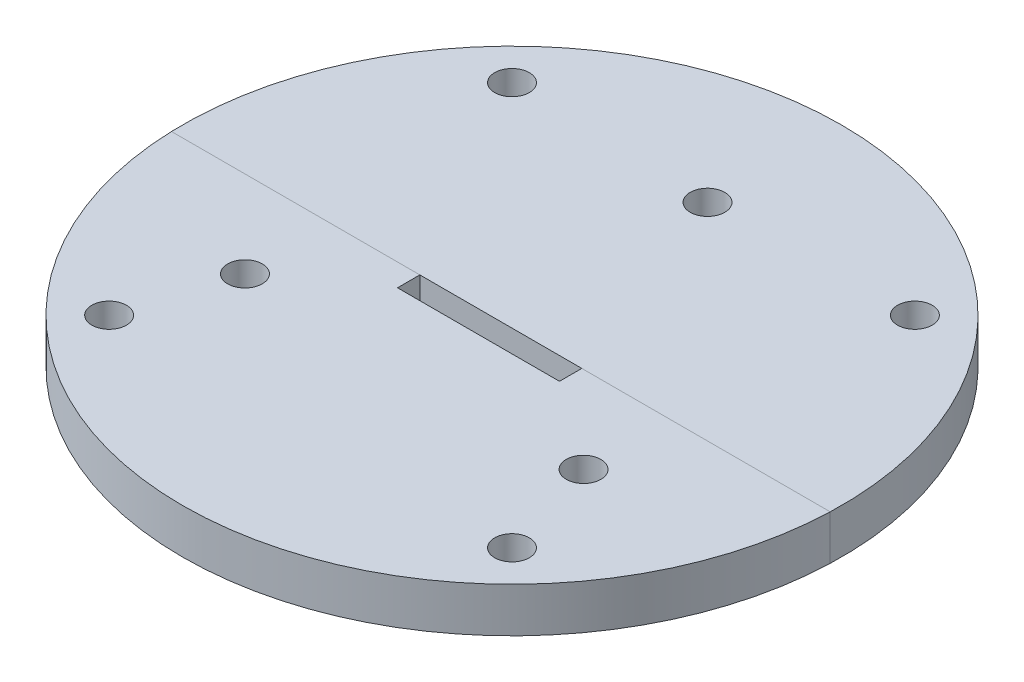
ISO-10303-21;
HEADER;
FILE_DESCRIPTION(('STEP AP214'),'2;1');
FILE_NAME('part.step','',(''),(''),'','','');
FILE_SCHEMA(('AUTOMOTIVE_DESIGN { 1 0 10303 214 1 1 1 1 }'));
ENDSEC;
DATA;
#1=APPLICATION_CONTEXT('core data for automotive mechanical design processes');
#2=APPLICATION_PROTOCOL_DEFINITION('international standard','automotive_design',2000,#1);
#3=PRODUCT_CONTEXT('',#1,'mechanical');
#4=PRODUCT('Part','Part','',(#3));
#5=PRODUCT_RELATED_PRODUCT_CATEGORY('part','',(#4));
#6=PRODUCT_DEFINITION_FORMATION('','',#4);
#7=PRODUCT_DEFINITION_CONTEXT('part definition',#1,'design');
#8=PRODUCT_DEFINITION('design','',#6,#7);
#9=PRODUCT_DEFINITION_SHAPE('','',#8);
#10=(LENGTH_UNIT() NAMED_UNIT(*) SI_UNIT(.MILLI.,.METRE.));
#11=(NAMED_UNIT(*) PLANE_ANGLE_UNIT() SI_UNIT($,.RADIAN.));
#12=(NAMED_UNIT(*) SI_UNIT($,.STERADIAN.) SOLID_ANGLE_UNIT());
#13=UNCERTAINTY_MEASURE_WITH_UNIT(LENGTH_MEASURE(1.E-05),#10,'distance_accuracy_value','');
#14=(GEOMETRIC_REPRESENTATION_CONTEXT(3) GLOBAL_UNCERTAINTY_ASSIGNED_CONTEXT((#13)) GLOBAL_UNIT_ASSIGNED_CONTEXT((#10,
#11,#12)) REPRESENTATION_CONTEXT('',''));
#15=CARTESIAN_POINT('',(0.,0.,0.));
#16=DIRECTION('',(0.,0.,1.));
#17=DIRECTION('',(1.,0.,0.));
#18=AXIS2_PLACEMENT_3D('',#15,#16,#17);
#19=CARTESIAN_POINT('',(-30.66172047433,-0.01,1.));
#20=DIRECTION('',(0.,0.,1.));
#21=DIRECTION('',(1.,0.,0.));
#22=AXIS2_PLACEMENT_3D('',#19,#20,#21);
#23=PLANE('',#22);
#24=DIRECTION('',(-1.,0.,0.));
#25=VECTOR('',#24,1.);
#26=CARTESIAN_POINT('',(-7.25,4.,1.));
#27=LINE('',#26,#25);
#28=CARTESIAN_POINT('',(29.4830459756111,4.,1.));
#29=VERTEX_POINT('',#28);
#30=CARTESIAN_POINT('',(-29.4830459756111,4.,1.));
#31=VERTEX_POINT('',#30);
#32=EDGE_CURVE('E62',#29,#31,#27,.T.);
#33=ORIENTED_EDGE('',*,*,#32,.T.);
#34=DIRECTION('',(0.,-1.,0.));
#35=VECTOR('',#34,1.);
#36=CARTESIAN_POINT('',(-29.4830459756111,4.,1.));
#37=LINE('',#36,#35);
#38=CARTESIAN_POINT('',(-29.4830459756111,0.,1.));
#39=VERTEX_POINT('',#38);
#40=EDGE_CURVE('E78',#31,#39,#37,.T.);
#41=ORIENTED_EDGE('',*,*,#40,.T.);
#42=DIRECTION('',(-1.,0.,0.));
#43=VECTOR('',#42,1.);
#44=CARTESIAN_POINT('',(-7.25,0.,1.));
#45=LINE('',#44,#43);
#46=CARTESIAN_POINT('',(29.4830459756111,0.,1.));
#47=VERTEX_POINT('',#46);
#48=EDGE_CURVE('E73',#47,#39,#45,.T.);
#49=ORIENTED_EDGE('',*,*,#48,.F.);
#50=DIRECTION('',(0.,-1.,0.));
#51=VECTOR('',#50,1.);
#52=CARTESIAN_POINT('',(29.4830459756111,4.,1.));
#53=LINE('',#52,#51);
#54=EDGE_CURVE('E76',#47,#29,#53,.F.);
#55=ORIENTED_EDGE('',*,*,#54,.T.);
#56=EDGE_LOOP('',(#33,#41,#49,#55));
#57=FACE_BOUND('',#56,.T.);
#58=ADVANCED_FACE('F46',(#57),#23,.T.);
#59=CARTESIAN_POINT('',(0.,4.,0.));
#60=DIRECTION('',(0.,-1.,0.));
#61=DIRECTION('',(0.,0.,-1.));
#62=AXIS2_PLACEMENT_3D('',#59,#60,#61);
#63=CYLINDRICAL_SURFACE('',#62,29.5);
#64=ORIENTED_EDGE('',*,*,#40,.F.);
#65=CARTESIAN_POINT('',(0.,4.,0.));
#66=DIRECTION('',(0.,1.,0.));
#67=DIRECTION('',(0.,0.,1.));
#68=AXIS2_PLACEMENT_3D('',#65,#66,#67);
#69=CIRCLE('',#68,29.5);
#70=EDGE_CURVE('E86',#29,#31,#69,.T.);
#71=ORIENTED_EDGE('',*,*,#70,.F.);
#72=ORIENTED_EDGE('',*,*,#54,.F.);
#73=CARTESIAN_POINT('',(0.,0.,0.));
#74=DIRECTION('',(0.,1.,0.));
#75=DIRECTION('',(0.,0.,1.));
#76=AXIS2_PLACEMENT_3D('',#73,#74,#75);
#77=CIRCLE('',#76,29.5);
#78=EDGE_CURVE('E50',#47,#39,#77,.T.);
#79=ORIENTED_EDGE('',*,*,#78,.T.);
#80=EDGE_LOOP('',(#64,#71,#72,#79));
#81=FACE_BOUND('',#80,.T.);
#82=ADVANCED_FACE('F87',(#81),#63,.T.);
#83=CARTESIAN_POINT('',(0.,4.,0.));
#84=DIRECTION('',(0.,1.,0.));
#85=DIRECTION('',(0.,0.,1.));
#86=AXIS2_PLACEMENT_3D('',#83,#84,#85);
#87=PLANE('',#86);
#88=CARTESIAN_POINT('',(-18.031222920257,4.,-18.0312229202569));
#89=DIRECTION('',(0.,1.,0.));
#90=DIRECTION('',(0.,0.,1.));
#91=AXIS2_PLACEMENT_3D('',#88,#89,#90);
#92=CIRCLE('',#91,1.55);
#93=CARTESIAN_POINT('',(-18.031222920257,4.,-16.4812229202569));
#94=VERTEX_POINT('',#93);
#95=EDGE_CURVE('E103',#94,#94,#92,.T.);
#96=ORIENTED_EDGE('',*,*,#95,.F.);
#97=EDGE_LOOP('',(#96));
#98=FACE_BOUND('',#97,.T.);
#99=CARTESIAN_POINT('',(18.0312229202567,4.,-18.0312229202572));
#100=DIRECTION('',(0.,1.,0.));
#101=DIRECTION('',(-1.,0.,0.));
#102=AXIS2_PLACEMENT_3D('',#99,#100,#101);
#103=CIRCLE('',#102,1.55);
#104=CARTESIAN_POINT('',(16.4812229202567,4.,-18.0312229202572));
#105=VERTEX_POINT('',#104);
#106=EDGE_CURVE('E81',#105,#105,#103,.T.);
#107=ORIENTED_EDGE('',*,*,#106,.F.);
#108=EDGE_LOOP('',(#107));
#109=FACE_BOUND('',#108,.T.);
#110=CARTESIAN_POINT('',(0.,4.,-17.5));
#111=DIRECTION('',(0.,1.,0.));
#112=DIRECTION('',(0.,0.,1.));
#113=AXIS2_PLACEMENT_3D('',#110,#111,#112);
#114=CIRCLE('',#113,1.55);
#115=CARTESIAN_POINT('',(0.,4.,-15.95));
#116=VERTEX_POINT('',#115);
#117=EDGE_CURVE('E12',#116,#116,#114,.T.);
#118=ORIENTED_EDGE('',*,*,#117,.F.);
#119=EDGE_LOOP('',(#118));
#120=FACE_BOUND('',#119,.T.);
#121=ORIENTED_EDGE('',*,*,#70,.T.);
#122=ORIENTED_EDGE('',*,*,#32,.F.);
#123=EDGE_LOOP('',(#121,#122));
#124=FACE_BOUND('',#123,.T.);
#125=ADVANCED_FACE('F48',(#98,#109,#120,#124),#87,.T.);
#126=CARTESIAN_POINT('',(0.,0.,0.));
#127=DIRECTION('',(0.,1.,0.));
#128=DIRECTION('',(0.,0.,1.));
#129=AXIS2_PLACEMENT_3D('',#126,#127,#128);
#130=PLANE('',#129);
#131=CARTESIAN_POINT('',(-18.031222920257,0.,-18.0312229202569));
#132=DIRECTION('',(0.,1.,0.));
#133=DIRECTION('',(0.,0.,1.));
#134=AXIS2_PLACEMENT_3D('',#131,#132,#133);
#135=CIRCLE('',#134,1.55);
#136=CARTESIAN_POINT('',(-18.031222920257,0.,-16.4812229202569));
#137=VERTEX_POINT('',#136);
#138=EDGE_CURVE('E85',#137,#137,#135,.T.);
#139=ORIENTED_EDGE('',*,*,#138,.T.);
#140=EDGE_LOOP('',(#139));
#141=FACE_BOUND('',#140,.T.);
#142=CARTESIAN_POINT('',(18.0312229202567,0.,-18.0312229202572));
#143=DIRECTION('',(0.,1.,0.));
#144=DIRECTION('',(-1.,0.,0.));
#145=AXIS2_PLACEMENT_3D('',#142,#143,#144);
#146=CIRCLE('',#145,1.55);
#147=CARTESIAN_POINT('',(16.4812229202567,0.,-18.0312229202572));
#148=VERTEX_POINT('',#147);
#149=EDGE_CURVE('E172',#148,#148,#146,.T.);
#150=ORIENTED_EDGE('',*,*,#149,.T.);
#151=EDGE_LOOP('',(#150));
#152=FACE_BOUND('',#151,.T.);
#153=CARTESIAN_POINT('',(0.,0.,-17.5));
#154=DIRECTION('',(0.,1.,0.));
#155=DIRECTION('',(0.,0.,1.));
#156=AXIS2_PLACEMENT_3D('',#153,#154,#155);
#157=CIRCLE('',#156,1.55);
#158=CARTESIAN_POINT('',(0.,0.,-15.95));
#159=VERTEX_POINT('',#158);
#160=EDGE_CURVE('E55',#159,#159,#157,.T.);
#161=ORIENTED_EDGE('',*,*,#160,.T.);
#162=EDGE_LOOP('',(#161));
#163=FACE_BOUND('',#162,.T.);
#164=ORIENTED_EDGE('',*,*,#48,.T.);
#165=ORIENTED_EDGE('',*,*,#78,.F.);
#166=EDGE_LOOP('',(#164,#165));
#167=FACE_BOUND('',#166,.T.);
#168=ADVANCED_FACE('F83',(#141,#152,#163,#167),#130,.F.);
#169=CARTESIAN_POINT('',(-18.031222920257,0.,-18.0312229202569));
#170=DIRECTION('',(0.,1.,0.));
#171=DIRECTION('',(0.,0.,1.));
#172=AXIS2_PLACEMENT_3D('',#169,#170,#171);
#173=CYLINDRICAL_SURFACE('',#172,1.55);
#174=ORIENTED_EDGE('',*,*,#138,.F.);
#175=EDGE_LOOP('',(#174));
#176=FACE_BOUND('',#175,.T.);
#177=ORIENTED_EDGE('',*,*,#95,.T.);
#178=EDGE_LOOP('',(#177));
#179=FACE_BOUND('',#178,.T.);
#180=ADVANCED_FACE('F97',(#176,#179),#173,.F.);
#181=CARTESIAN_POINT('',(18.0312229202567,0.,-18.0312229202572));
#182=DIRECTION('',(0.,1.,0.));
#183=DIRECTION('',(0.,0.,1.));
#184=AXIS2_PLACEMENT_3D('',#181,#182,#183);
#185=CYLINDRICAL_SURFACE('',#184,1.55);
#186=ORIENTED_EDGE('',*,*,#149,.F.);
#187=EDGE_LOOP('',(#186));
#188=FACE_BOUND('',#187,.T.);
#189=ORIENTED_EDGE('',*,*,#106,.T.);
#190=EDGE_LOOP('',(#189));
#191=FACE_BOUND('',#190,.T.);
#192=ADVANCED_FACE('F111',(#188,#191),#185,.F.);
#193=CARTESIAN_POINT('',(0.,0.,-17.5));
#194=DIRECTION('',(0.,1.,0.));
#195=DIRECTION('',(0.,0.,1.));
#196=AXIS2_PLACEMENT_3D('',#193,#194,#195);
#197=CYLINDRICAL_SURFACE('',#196,1.55);
#198=ORIENTED_EDGE('',*,*,#160,.F.);
#199=EDGE_LOOP('',(#198));
#200=FACE_BOUND('',#199,.T.);
#201=ORIENTED_EDGE('',*,*,#117,.T.);
#202=EDGE_LOOP('',(#201));
#203=FACE_BOUND('',#202,.T.);
#204=ADVANCED_FACE('F109',(#200,#203),#197,.F.);
#205=CLOSED_SHELL('',(#58,#82,#125,#168,#180,#192,#204));
#206=MANIFOLD_SOLID_BREP('B2',#205);
#207=CARTESIAN_POINT('',(-30.66172047433,-0.01,1.));
#208=DIRECTION('',(0.,0.,1.));
#209=DIRECTION('',(1.,0.,0.));
#210=AXIS2_PLACEMENT_3D('',#207,#208,#209);
#211=PLANE('',#210);
#212=DIRECTION('',(1.,0.,0.));
#213=VECTOR('',#212,1.);
#214=CARTESIAN_POINT('',(0.,4.,1.));
#215=LINE('',#214,#213);
#216=CARTESIAN_POINT('',(-29.4830459756111,4.,1.));
#217=VERTEX_POINT('',#216);
#218=CARTESIAN_POINT('',(-7.25,4.,1.));
#219=VERTEX_POINT('',#218);
#220=EDGE_CURVE('E299',#217,#219,#215,.T.);
#221=ORIENTED_EDGE('',*,*,#220,.T.);
#222=DIRECTION('',(0.,1.,0.));
#223=VECTOR('',#222,1.);
#224=CARTESIAN_POINT('',(-7.25,0.,1.));
#225=LINE('',#224,#223);
#226=CARTESIAN_POINT('',(-7.25,0.,1.));
#227=VERTEX_POINT('',#226);
#228=EDGE_CURVE('E277',#227,#219,#225,.T.);
#229=ORIENTED_EDGE('',*,*,#228,.F.);
#230=DIRECTION('',(1.,0.,0.));
#231=VECTOR('',#230,1.);
#232=CARTESIAN_POINT('',(0.,0.,1.));
#233=LINE('',#232,#231);
#234=CARTESIAN_POINT('',(-29.4830459756111,0.,1.));
#235=VERTEX_POINT('',#234);
#236=EDGE_CURVE('E263',#235,#227,#233,.T.);
#237=ORIENTED_EDGE('',*,*,#236,.F.);
#238=DIRECTION('',(0.,-1.,0.));
#239=VECTOR('',#238,1.);
#240=CARTESIAN_POINT('',(-29.4830459756111,4.,1.));
#241=LINE('',#240,#239);
#242=EDGE_CURVE('E189',#217,#235,#241,.T.);
#243=ORIENTED_EDGE('',*,*,#242,.F.);
#244=EDGE_LOOP('',(#221,#229,#237,#243));
#245=FACE_BOUND('',#244,.T.);
#246=ADVANCED_FACE('F186',(#245),#211,.F.);
#247=CARTESIAN_POINT('',(7.25,0.,1.));
#248=VERTEX_POINT('',#247);
#249=CARTESIAN_POINT('',(29.4830459756111,0.,1.));
#250=VERTEX_POINT('',#249);
#251=EDGE_CURVE('E295',#248,#250,#233,.T.);
#252=ORIENTED_EDGE('',*,*,#251,.F.);
#253=DIRECTION('',(0.,1.,0.));
#254=VECTOR('',#253,1.);
#255=CARTESIAN_POINT('',(7.25,0.,1.));
#256=LINE('',#255,#254);
#257=CARTESIAN_POINT('',(7.25,4.,1.));
#258=VERTEX_POINT('',#257);
#259=EDGE_CURVE('E44',#248,#258,#256,.T.);
#260=ORIENTED_EDGE('',*,*,#259,.T.);
#261=CARTESIAN_POINT('',(29.4830459756111,4.,1.));
#262=VERTEX_POINT('',#261);
#263=EDGE_CURVE('E194',#258,#262,#215,.T.);
#264=ORIENTED_EDGE('',*,*,#263,.T.);
#265=DIRECTION('',(0.,-1.,0.));
#266=VECTOR('',#265,1.);
#267=CARTESIAN_POINT('',(29.4830459756111,4.,1.));
#268=LINE('',#267,#266);
#269=EDGE_CURVE('E300',#250,#262,#268,.F.);
#270=ORIENTED_EDGE('',*,*,#269,.F.);
#271=EDGE_LOOP('',(#252,#260,#264,#270));
#272=FACE_BOUND('',#271,.T.);
#273=ADVANCED_FACE('F327',(#272),#211,.F.);
#274=CARTESIAN_POINT('',(18.031222920257,0.,18.0312229202569));
#275=DIRECTION('',(0.,1.,0.));
#276=DIRECTION('',(0.,0.,1.));
#277=AXIS2_PLACEMENT_3D('',#274,#275,#276);
#278=CYLINDRICAL_SURFACE('',#277,1.55);
#279=CARTESIAN_POINT('',(18.031222920257,0.,18.0312229202569));
#280=DIRECTION('',(0.,1.,0.));
#281=DIRECTION('',(0.,0.,-1.));
#282=AXIS2_PLACEMENT_3D('',#279,#280,#281);
#283=CIRCLE('',#282,1.55);
#284=CARTESIAN_POINT('',(18.031222920257,0.,16.4812229202569));
#285=VERTEX_POINT('',#284);
#286=EDGE_CURVE('E288',#285,#285,#283,.T.);
#287=ORIENTED_EDGE('',*,*,#286,.F.);
#288=EDGE_LOOP('',(#287));
#289=FACE_BOUND('',#288,.T.);
#290=CARTESIAN_POINT('',(18.031222920257,4.,18.0312229202569));
#291=DIRECTION('',(0.,1.,0.));
#292=DIRECTION('',(0.,0.,-1.));
#293=AXIS2_PLACEMENT_3D('',#290,#291,#292);
#294=CIRCLE('',#293,1.55);
#295=CARTESIAN_POINT('',(18.031222920257,4.,16.4812229202569));
#296=VERTEX_POINT('',#295);
#297=EDGE_CURVE('E278',#296,#296,#294,.T.);
#298=ORIENTED_EDGE('',*,*,#297,.T.);
#299=EDGE_LOOP('',(#298));
#300=FACE_BOUND('',#299,.T.);
#301=ADVANCED_FACE('F322',(#289,#300),#278,.F.);
#302=CARTESIAN_POINT('',(-18.0312229202569,0.,18.0312229202571));
#303=DIRECTION('',(0.,1.,0.));
#304=DIRECTION('',(0.,0.,1.));
#305=AXIS2_PLACEMENT_3D('',#302,#303,#304);
#306=CYLINDRICAL_SURFACE('',#305,1.55);
#307=CARTESIAN_POINT('',(-18.0312229202569,0.,18.0312229202571));
#308=DIRECTION('',(0.,1.,0.));
#309=DIRECTION('',(1.,0.,0.));
#310=AXIS2_PLACEMENT_3D('',#307,#308,#309);
#311=CIRCLE('',#310,1.55);
#312=CARTESIAN_POINT('',(-16.4812229202569,0.,18.0312229202571));
#313=VERTEX_POINT('',#312);
#314=EDGE_CURVE('E281',#313,#313,#311,.T.);
#315=ORIENTED_EDGE('',*,*,#314,.F.);
#316=EDGE_LOOP('',(#315));
#317=FACE_BOUND('',#316,.T.);
#318=CARTESIAN_POINT('',(-18.0312229202569,4.,18.0312229202571));
#319=DIRECTION('',(0.,1.,0.));
#320=DIRECTION('',(1.,0.,0.));
#321=AXIS2_PLACEMENT_3D('',#318,#319,#320);
#322=CIRCLE('',#321,1.55);
#323=CARTESIAN_POINT('',(-16.4812229202569,4.,18.0312229202571));
#324=VERTEX_POINT('',#323);
#325=EDGE_CURVE('E285',#324,#324,#322,.T.);
#326=ORIENTED_EDGE('',*,*,#325,.T.);
#327=EDGE_LOOP('',(#326));
#328=FACE_BOUND('',#327,.T.);
#329=ADVANCED_FACE('F314',(#317,#328),#306,.F.);
#330=CARTESIAN_POINT('',(0.,4.,0.));
#331=DIRECTION('',(0.,-1.,0.));
#332=DIRECTION('',(0.,0.,-1.));
#333=AXIS2_PLACEMENT_3D('',#330,#331,#332);
#334=CYLINDRICAL_SURFACE('',#333,29.5);
#335=CARTESIAN_POINT('',(0.,4.,0.));
#336=DIRECTION('',(0.,1.,0.));
#337=DIRECTION('',(0.,0.,1.));
#338=AXIS2_PLACEMENT_3D('',#335,#336,#337);
#339=CIRCLE('',#338,29.5);
#340=EDGE_CURVE('E293',#217,#262,#339,.T.);
#341=ORIENTED_EDGE('',*,*,#340,.F.);
#342=ORIENTED_EDGE('',*,*,#242,.T.);
#343=CARTESIAN_POINT('',(0.,0.,0.));
#344=DIRECTION('',(0.,1.,0.));
#345=DIRECTION('',(0.,0.,1.));
#346=AXIS2_PLACEMENT_3D('',#343,#344,#345);
#347=CIRCLE('',#346,29.5);
#348=EDGE_CURVE('E284',#235,#250,#347,.T.);
#349=ORIENTED_EDGE('',*,*,#348,.T.);
#350=ORIENTED_EDGE('',*,*,#269,.T.);
#351=EDGE_LOOP('',(#341,#342,#349,#350));
#352=FACE_BOUND('',#351,.T.);
#353=ADVANCED_FACE('F311',(#352),#334,.T.);
#354=CARTESIAN_POINT('',(15.1554445662278,0.,8.74999999999986));
#355=DIRECTION('',(0.,1.,0.));
#356=DIRECTION('',(0.,0.,1.));
#357=AXIS2_PLACEMENT_3D('',#354,#355,#356);
#358=CYLINDRICAL_SURFACE('',#357,1.55);
#359=CARTESIAN_POINT('',(15.1554445662278,0.,8.74999999999986));
#360=DIRECTION('',(0.,1.,0.));
#361=DIRECTION('',(-0.866025403784443,0.,-0.499999999999992));
#362=AXIS2_PLACEMENT_3D('',#359,#360,#361);
#363=CIRCLE('',#362,1.55);
#364=CARTESIAN_POINT('',(13.8131051903619,0.,7.97499999999987));
#365=VERTEX_POINT('',#364);
#366=EDGE_CURVE('E355',#365,#365,#363,.T.);
#367=ORIENTED_EDGE('',*,*,#366,.F.);
#368=EDGE_LOOP('',(#367));
#369=FACE_BOUND('',#368,.T.);
#370=CARTESIAN_POINT('',(15.1554445662278,4.,8.74999999999986));
#371=DIRECTION('',(0.,1.,0.));
#372=DIRECTION('',(-0.866025403784443,0.,-0.499999999999992));
#373=AXIS2_PLACEMENT_3D('',#370,#371,#372);
#374=CIRCLE('',#373,1.55);
#375=CARTESIAN_POINT('',(13.8131051903619,4.,7.97499999999987));
#376=VERTEX_POINT('',#375);
#377=EDGE_CURVE('E270',#376,#376,#374,.T.);
#378=ORIENTED_EDGE('',*,*,#377,.T.);
#379=EDGE_LOOP('',(#378));
#380=FACE_BOUND('',#379,.T.);
#381=ADVANCED_FACE('F313',(#369,#380),#358,.F.);
#382=CARTESIAN_POINT('',(-15.1554445662276,0.,8.75000000000007));
#383=DIRECTION('',(0.,1.,0.));
#384=DIRECTION('',(0.,0.,1.));
#385=AXIS2_PLACEMENT_3D('',#382,#383,#384);
#386=CYLINDRICAL_SURFACE('',#385,1.55);
#387=CARTESIAN_POINT('',(-15.1554445662276,0.,8.75000000000007));
#388=DIRECTION('',(0.,1.,0.));
#389=DIRECTION('',(0.866025403784436,0.,-0.500000000000004));
#390=AXIS2_PLACEMENT_3D('',#387,#388,#389);
#391=CIRCLE('',#390,1.55);
#392=CARTESIAN_POINT('',(-13.8131051903618,0.,7.97500000000007));
#393=VERTEX_POINT('',#392);
#394=EDGE_CURVE('E275',#393,#393,#391,.T.);
#395=ORIENTED_EDGE('',*,*,#394,.F.);
#396=EDGE_LOOP('',(#395));
#397=FACE_BOUND('',#396,.T.);
#398=CARTESIAN_POINT('',(-15.1554445662276,4.,8.75000000000007));
#399=DIRECTION('',(0.,1.,0.));
#400=DIRECTION('',(0.866025403784436,0.,-0.500000000000004));
#401=AXIS2_PLACEMENT_3D('',#398,#399,#400);
#402=CIRCLE('',#401,1.55);
#403=CARTESIAN_POINT('',(-13.8131051903618,4.,7.97500000000007));
#404=VERTEX_POINT('',#403);
#405=EDGE_CURVE('E356',#404,#404,#402,.T.);
#406=ORIENTED_EDGE('',*,*,#405,.T.);
#407=EDGE_LOOP('',(#406));
#408=FACE_BOUND('',#407,.T.);
#409=ADVANCED_FACE('F319',(#397,#408),#386,.F.);
#410=CARTESIAN_POINT('',(-7.25,0.,3.));
#411=DIRECTION('',(0.,0.,1.));
#412=DIRECTION('',(1.,0.,0.));
#413=AXIS2_PLACEMENT_3D('',#410,#411,#412);
#414=PLANE('',#413);
#415=DIRECTION('',(1.,0.,0.));
#416=VECTOR('',#415,1.);
#417=CARTESIAN_POINT('',(-7.25,4.,3.));
#418=LINE('',#417,#416);
#419=CARTESIAN_POINT('',(-7.25,4.,3.));
#420=VERTEX_POINT('',#419);
#421=CARTESIAN_POINT('',(7.25,4.,3.));
#422=VERTEX_POINT('',#421);
#423=EDGE_CURVE('E267',#420,#422,#418,.T.);
#424=ORIENTED_EDGE('',*,*,#423,.T.);
#425=DIRECTION('',(0.,1.,0.));
#426=VECTOR('',#425,1.);
#427=CARTESIAN_POINT('',(7.25,0.,3.));
#428=LINE('',#427,#426);
#429=CARTESIAN_POINT('',(7.25,0.,3.));
#430=VERTEX_POINT('',#429);
#431=EDGE_CURVE('E249',#430,#422,#428,.T.);
#432=ORIENTED_EDGE('',*,*,#431,.F.);
#433=DIRECTION('',(1.,0.,0.));
#434=VECTOR('',#433,1.);
#435=CARTESIAN_POINT('',(-7.25,0.,3.));
#436=LINE('',#435,#434);
#437=CARTESIAN_POINT('',(-7.25,0.,3.));
#438=VERTEX_POINT('',#437);
#439=EDGE_CURVE('E254',#438,#430,#436,.T.);
#440=ORIENTED_EDGE('',*,*,#439,.F.);
#441=DIRECTION('',(0.,1.,0.));
#442=VECTOR('',#441,1.);
#443=CARTESIAN_POINT('',(-7.25,0.,3.));
#444=LINE('',#443,#442);
#445=EDGE_CURVE('E239',#438,#420,#444,.T.);
#446=ORIENTED_EDGE('',*,*,#445,.T.);
#447=EDGE_LOOP('',(#424,#432,#440,#446));
#448=FACE_BOUND('',#447,.T.);
#449=ADVANCED_FACE('F255',(#448),#414,.F.);
#450=CARTESIAN_POINT('',(0.,0.,0.));
#451=DIRECTION('',(0.,1.,0.));
#452=DIRECTION('',(0.,0.,1.));
#453=AXIS2_PLACEMENT_3D('',#450,#451,#452);
#454=PLANE('',#453);
#455=ORIENTED_EDGE('',*,*,#394,.T.);
#456=EDGE_LOOP('',(#455));
#457=FACE_BOUND('',#456,.T.);
#458=ORIENTED_EDGE('',*,*,#366,.T.);
#459=EDGE_LOOP('',(#458));
#460=FACE_BOUND('',#459,.T.);
#461=ORIENTED_EDGE('',*,*,#348,.F.);
#462=ORIENTED_EDGE('',*,*,#236,.T.);
#463=DIRECTION('',(0.,0.,1.));
#464=VECTOR('',#463,1.);
#465=CARTESIAN_POINT('',(-7.25,0.,1.));
#466=LINE('',#465,#464);
#467=EDGE_CURVE('E243',#227,#438,#466,.T.);
#468=ORIENTED_EDGE('',*,*,#467,.T.);
#469=ORIENTED_EDGE('',*,*,#439,.T.);
#470=DIRECTION('',(0.,0.,-1.));
#471=VECTOR('',#470,1.);
#472=CARTESIAN_POINT('',(7.25,0.,1.));
#473=LINE('',#472,#471);
#474=EDGE_CURVE('E250',#430,#248,#473,.T.);
#475=ORIENTED_EDGE('',*,*,#474,.T.);
#476=ORIENTED_EDGE('',*,*,#251,.T.);
#477=EDGE_LOOP('',(#461,#462,#468,#469,#475,#476));
#478=FACE_BOUND('',#477,.T.);
#479=ORIENTED_EDGE('',*,*,#314,.T.);
#480=EDGE_LOOP('',(#479));
#481=FACE_BOUND('',#480,.T.);
#482=ORIENTED_EDGE('',*,*,#286,.T.);
#483=EDGE_LOOP('',(#482));
#484=FACE_BOUND('',#483,.T.);
#485=ADVANCED_FACE('F260',(#457,#460,#478,#481,#484),#454,.F.);
#486=CARTESIAN_POINT('',(0.,4.,0.));
#487=DIRECTION('',(0.,1.,0.));
#488=DIRECTION('',(0.,0.,1.));
#489=AXIS2_PLACEMENT_3D('',#486,#487,#488);
#490=PLANE('',#489);
#491=ORIENTED_EDGE('',*,*,#220,.F.);
#492=ORIENTED_EDGE('',*,*,#340,.T.);
#493=ORIENTED_EDGE('',*,*,#263,.F.);
#494=DIRECTION('',(0.,0.,-1.));
#495=VECTOR('',#494,1.);
#496=CARTESIAN_POINT('',(7.25,4.,1.));
#497=LINE('',#496,#495);
#498=EDGE_CURVE('E265',#422,#258,#497,.T.);
#499=ORIENTED_EDGE('',*,*,#498,.F.);
#500=ORIENTED_EDGE('',*,*,#423,.F.);
#501=DIRECTION('',(0.,0.,1.));
#502=VECTOR('',#501,1.);
#503=CARTESIAN_POINT('',(-7.25,4.,1.));
#504=LINE('',#503,#502);
#505=EDGE_CURVE('E245',#219,#420,#504,.T.);
#506=ORIENTED_EDGE('',*,*,#505,.F.);
#507=EDGE_LOOP('',(#491,#492,#493,#499,#500,#506));
#508=FACE_BOUND('',#507,.T.);
#509=ORIENTED_EDGE('',*,*,#405,.F.);
#510=EDGE_LOOP('',(#509));
#511=FACE_BOUND('',#510,.T.);
#512=ORIENTED_EDGE('',*,*,#377,.F.);
#513=EDGE_LOOP('',(#512));
#514=FACE_BOUND('',#513,.T.);
#515=ORIENTED_EDGE('',*,*,#325,.F.);
#516=EDGE_LOOP('',(#515));
#517=FACE_BOUND('',#516,.T.);
#518=ORIENTED_EDGE('',*,*,#297,.F.);
#519=EDGE_LOOP('',(#518));
#520=FACE_BOUND('',#519,.T.);
#521=ADVANCED_FACE('F306',(#508,#511,#514,#517,#520),#490,.T.);
#522=CARTESIAN_POINT('',(7.25,0.,1.));
#523=DIRECTION('',(1.,0.,0.));
#524=DIRECTION('',(0.,0.,-1.));
#525=AXIS2_PLACEMENT_3D('',#522,#523,#524);
#526=PLANE('',#525);
#527=ORIENTED_EDGE('',*,*,#498,.T.);
#528=ORIENTED_EDGE('',*,*,#259,.F.);
#529=ORIENTED_EDGE('',*,*,#474,.F.);
#530=ORIENTED_EDGE('',*,*,#431,.T.);
#531=EDGE_LOOP('',(#527,#528,#529,#530));
#532=FACE_BOUND('',#531,.T.);
#533=ADVANCED_FACE('F308',(#532),#526,.F.);
#534=CARTESIAN_POINT('',(-7.25,0.,1.));
#535=DIRECTION('',(-1.,0.,0.));
#536=DIRECTION('',(0.,0.,1.));
#537=AXIS2_PLACEMENT_3D('',#534,#535,#536);
#538=PLANE('',#537);
#539=ORIENTED_EDGE('',*,*,#505,.T.);
#540=ORIENTED_EDGE('',*,*,#445,.F.);
#541=ORIENTED_EDGE('',*,*,#467,.F.);
#542=ORIENTED_EDGE('',*,*,#228,.T.);
#543=EDGE_LOOP('',(#539,#540,#541,#542));
#544=FACE_BOUND('',#543,.T.);
#545=ADVANCED_FACE('F241',(#544),#538,.F.);
#546=CLOSED_SHELL('',(#246,#273,#301,#329,#353,#381,#409,#449,#485,#521,#533,#545));
#547=MANIFOLD_SOLID_BREP('B6',#546);
#548=ADVANCED_BREP_SHAPE_REPRESENTATION('',(#18,#206,#547),#14);
#549=SHAPE_DEFINITION_REPRESENTATION(#9,#548);
ENDSEC;
END-ISO-10303-21;
